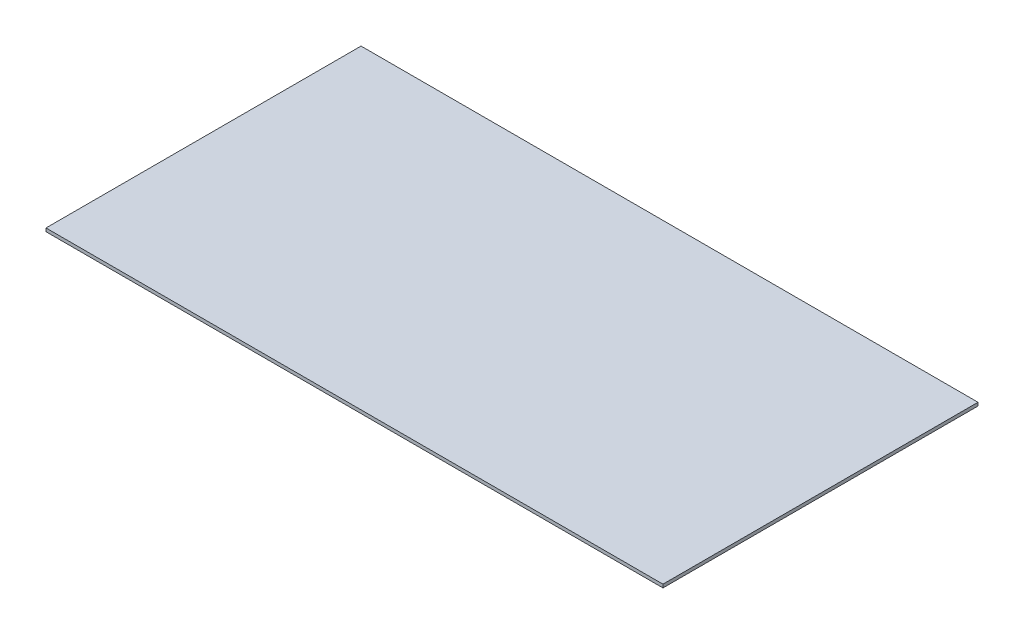
ISO-10303-21;
HEADER;
FILE_DESCRIPTION(('STEP AP214'),'2;1');
FILE_NAME('part.step','',(''),(''),'','','');
FILE_SCHEMA(('AUTOMOTIVE_DESIGN { 1 0 10303 214 1 1 1 1 }'));
ENDSEC;
DATA;
#1=APPLICATION_CONTEXT('core data for automotive mechanical design processes');
#2=APPLICATION_PROTOCOL_DEFINITION('international standard','automotive_design',2000,#1);
#3=PRODUCT_CONTEXT('',#1,'mechanical');
#4=PRODUCT('Part','Part','',(#3));
#5=PRODUCT_RELATED_PRODUCT_CATEGORY('part','',(#4));
#6=PRODUCT_DEFINITION_FORMATION('','',#4);
#7=PRODUCT_DEFINITION_CONTEXT('part definition',#1,'design');
#8=PRODUCT_DEFINITION('design','',#6,#7);
#9=PRODUCT_DEFINITION_SHAPE('','',#8);
#10=(LENGTH_UNIT() NAMED_UNIT(*) SI_UNIT(.MILLI.,.METRE.));
#11=(NAMED_UNIT(*) PLANE_ANGLE_UNIT() SI_UNIT($,.RADIAN.));
#12=(NAMED_UNIT(*) SI_UNIT($,.STERADIAN.) SOLID_ANGLE_UNIT());
#13=UNCERTAINTY_MEASURE_WITH_UNIT(LENGTH_MEASURE(1.E-05),#10,'distance_accuracy_value','');
#14=(GEOMETRIC_REPRESENTATION_CONTEXT(3) GLOBAL_UNCERTAINTY_ASSIGNED_CONTEXT((#13)) GLOBAL_UNIT_ASSIGNED_CONTEXT((#10,
#11,#12)) REPRESENTATION_CONTEXT('',''));
#15=CARTESIAN_POINT('',(0.,0.,0.));
#16=DIRECTION('',(0.,0.,1.));
#17=DIRECTION('',(1.,0.,0.));
#18=AXIS2_PLACEMENT_3D('',#15,#16,#17);
#19=CARTESIAN_POINT('',(596.9,6.35,304.8));
#20=DIRECTION('',(-1.,0.,0.));
#21=DIRECTION('',(0.,0.,1.));
#22=AXIS2_PLACEMENT_3D('',#19,#20,#21);
#23=PLANE('',#22);
#24=DIRECTION('',(0.,0.,-1.));
#25=VECTOR('',#24,1.);
#26=CARTESIAN_POINT('',(596.9,0.,304.8));
#27=LINE('',#26,#25);
#28=CARTESIAN_POINT('',(596.9,0.,304.8));
#29=VERTEX_POINT('',#28);
#30=CARTESIAN_POINT('',(596.9,0.,-304.8));
#31=VERTEX_POINT('',#30);
#32=EDGE_CURVE('E111',#29,#31,#27,.T.);
#33=ORIENTED_EDGE('',*,*,#32,.T.);
#34=DIRECTION('',(0.,-1.,0.));
#35=VECTOR('',#34,1.);
#36=CARTESIAN_POINT('',(596.9,6.35,-304.8));
#37=LINE('',#36,#35);
#38=CARTESIAN_POINT('',(596.9,6.35,-304.8));
#39=VERTEX_POINT('',#38);
#40=EDGE_CURVE('E11',#39,#31,#37,.T.);
#41=ORIENTED_EDGE('',*,*,#40,.F.);
#42=DIRECTION('',(0.,0.,-1.));
#43=VECTOR('',#42,1.);
#44=CARTESIAN_POINT('',(596.9,6.35,304.8));
#45=LINE('',#44,#43);
#46=CARTESIAN_POINT('',(596.9,6.35,304.8));
#47=VERTEX_POINT('',#46);
#48=EDGE_CURVE('E95',#47,#39,#45,.T.);
#49=ORIENTED_EDGE('',*,*,#48,.F.);
#50=DIRECTION('',(0.,-1.,0.));
#51=VECTOR('',#50,1.);
#52=CARTESIAN_POINT('',(596.9,6.35,304.8));
#53=LINE('',#52,#51);
#54=EDGE_CURVE('E107',#47,#29,#53,.T.);
#55=ORIENTED_EDGE('',*,*,#54,.T.);
#56=EDGE_LOOP('',(#33,#41,#49,#55));
#57=FACE_BOUND('',#56,.T.);
#58=ADVANCED_FACE('F43',(#57),#23,.F.);
#59=CARTESIAN_POINT('',(-596.9,6.35,-304.8));
#60=DIRECTION('',(0.,0.,1.));
#61=DIRECTION('',(1.,0.,0.));
#62=AXIS2_PLACEMENT_3D('',#59,#60,#61);
#63=PLANE('',#62);
#64=DIRECTION('',(-1.,0.,0.));
#65=VECTOR('',#64,1.);
#66=CARTESIAN_POINT('',(-596.9,0.,-304.8));
#67=LINE('',#66,#65);
#68=CARTESIAN_POINT('',(-596.9,0.,-304.8));
#69=VERTEX_POINT('',#68);
#70=EDGE_CURVE('E100',#31,#69,#67,.T.);
#71=ORIENTED_EDGE('',*,*,#70,.T.);
#72=DIRECTION('',(0.,-1.,0.));
#73=VECTOR('',#72,1.);
#74=CARTESIAN_POINT('',(-596.9,6.35,-304.8));
#75=LINE('',#74,#73);
#76=CARTESIAN_POINT('',(-596.9,6.35,-304.8));
#77=VERTEX_POINT('',#76);
#78=EDGE_CURVE('E52',#77,#69,#75,.T.);
#79=ORIENTED_EDGE('',*,*,#78,.F.);
#80=DIRECTION('',(-1.,0.,0.));
#81=VECTOR('',#80,1.);
#82=CARTESIAN_POINT('',(-596.9,6.35,-304.8));
#83=LINE('',#82,#81);
#84=EDGE_CURVE('E90',#39,#77,#83,.T.);
#85=ORIENTED_EDGE('',*,*,#84,.F.);
#86=ORIENTED_EDGE('',*,*,#40,.T.);
#87=EDGE_LOOP('',(#71,#79,#85,#86));
#88=FACE_BOUND('',#87,.T.);
#89=ADVANCED_FACE('F99',(#88),#63,.F.);
#90=CARTESIAN_POINT('',(-596.9,6.35,304.8));
#91=DIRECTION('',(1.,0.,0.));
#92=DIRECTION('',(0.,0.,-1.));
#93=AXIS2_PLACEMENT_3D('',#90,#91,#92);
#94=PLANE('',#93);
#95=DIRECTION('',(0.,0.,1.));
#96=VECTOR('',#95,1.);
#97=CARTESIAN_POINT('',(-596.9,0.,304.8));
#98=LINE('',#97,#96);
#99=CARTESIAN_POINT('',(-596.9,0.,304.8));
#100=VERTEX_POINT('',#99);
#101=EDGE_CURVE('E77',#69,#100,#98,.T.);
#102=ORIENTED_EDGE('',*,*,#101,.T.);
#103=DIRECTION('',(0.,-1.,0.));
#104=VECTOR('',#103,1.);
#105=CARTESIAN_POINT('',(-596.9,6.35,304.8));
#106=LINE('',#105,#104);
#107=CARTESIAN_POINT('',(-596.9,6.35,304.8));
#108=VERTEX_POINT('',#107);
#109=EDGE_CURVE('E102',#108,#100,#106,.T.);
#110=ORIENTED_EDGE('',*,*,#109,.F.);
#111=DIRECTION('',(0.,0.,1.));
#112=VECTOR('',#111,1.);
#113=CARTESIAN_POINT('',(-596.9,6.35,304.8));
#114=LINE('',#113,#112);
#115=EDGE_CURVE('E93',#77,#108,#114,.T.);
#116=ORIENTED_EDGE('',*,*,#115,.F.);
#117=ORIENTED_EDGE('',*,*,#78,.T.);
#118=EDGE_LOOP('',(#102,#110,#116,#117));
#119=FACE_BOUND('',#118,.T.);
#120=ADVANCED_FACE('F103',(#119),#94,.F.);
#121=CARTESIAN_POINT('',(-596.9,6.35,304.8));
#122=DIRECTION('',(0.,0.,-1.));
#123=DIRECTION('',(-1.,0.,0.));
#124=AXIS2_PLACEMENT_3D('',#121,#122,#123);
#125=PLANE('',#124);
#126=DIRECTION('',(1.,0.,0.));
#127=VECTOR('',#126,1.);
#128=CARTESIAN_POINT('',(-596.9,0.,304.8));
#129=LINE('',#128,#127);
#130=EDGE_CURVE('E83',#100,#29,#129,.T.);
#131=ORIENTED_EDGE('',*,*,#130,.T.);
#132=ORIENTED_EDGE('',*,*,#54,.F.);
#133=DIRECTION('',(1.,0.,0.));
#134=VECTOR('',#133,1.);
#135=CARTESIAN_POINT('',(-596.9,6.35,304.8));
#136=LINE('',#135,#134);
#137=EDGE_CURVE('E60',#108,#47,#136,.T.);
#138=ORIENTED_EDGE('',*,*,#137,.F.);
#139=ORIENTED_EDGE('',*,*,#109,.T.);
#140=EDGE_LOOP('',(#131,#132,#138,#139));
#141=FACE_BOUND('',#140,.T.);
#142=ADVANCED_FACE('F124',(#141),#125,.F.);
#143=CARTESIAN_POINT('',(0.,6.35,0.));
#144=DIRECTION('',(0.,-1.,0.));
#145=DIRECTION('',(0.,0.,-1.));
#146=AXIS2_PLACEMENT_3D('',#143,#144,#145);
#147=PLANE('',#146);
#148=ORIENTED_EDGE('',*,*,#48,.T.);
#149=ORIENTED_EDGE('',*,*,#84,.T.);
#150=ORIENTED_EDGE('',*,*,#115,.T.);
#151=ORIENTED_EDGE('',*,*,#137,.T.);
#152=EDGE_LOOP('',(#148,#149,#150,#151));
#153=FACE_BOUND('',#152,.T.);
#154=ADVANCED_FACE('F91',(#153),#147,.F.);
#155=CARTESIAN_POINT('',(0.,0.,0.));
#156=DIRECTION('',(0.,-1.,0.));
#157=DIRECTION('',(0.,0.,-1.));
#158=AXIS2_PLACEMENT_3D('',#155,#156,#157);
#159=PLANE('',#158);
#160=ORIENTED_EDGE('',*,*,#32,.F.);
#161=ORIENTED_EDGE('',*,*,#130,.F.);
#162=ORIENTED_EDGE('',*,*,#101,.F.);
#163=ORIENTED_EDGE('',*,*,#70,.F.);
#164=EDGE_LOOP('',(#160,#161,#162,#163));
#165=FACE_BOUND('',#164,.T.);
#166=ADVANCED_FACE('F127',(#165),#159,.T.);
#167=CLOSED_SHELL('',(#58,#89,#120,#142,#154,#166));
#168=MANIFOLD_SOLID_BREP('B2',#167);
#169=ADVANCED_BREP_SHAPE_REPRESENTATION('',(#18,#168),#14);
#170=SHAPE_DEFINITION_REPRESENTATION(#9,#169);
ENDSEC;
END-ISO-10303-21;
